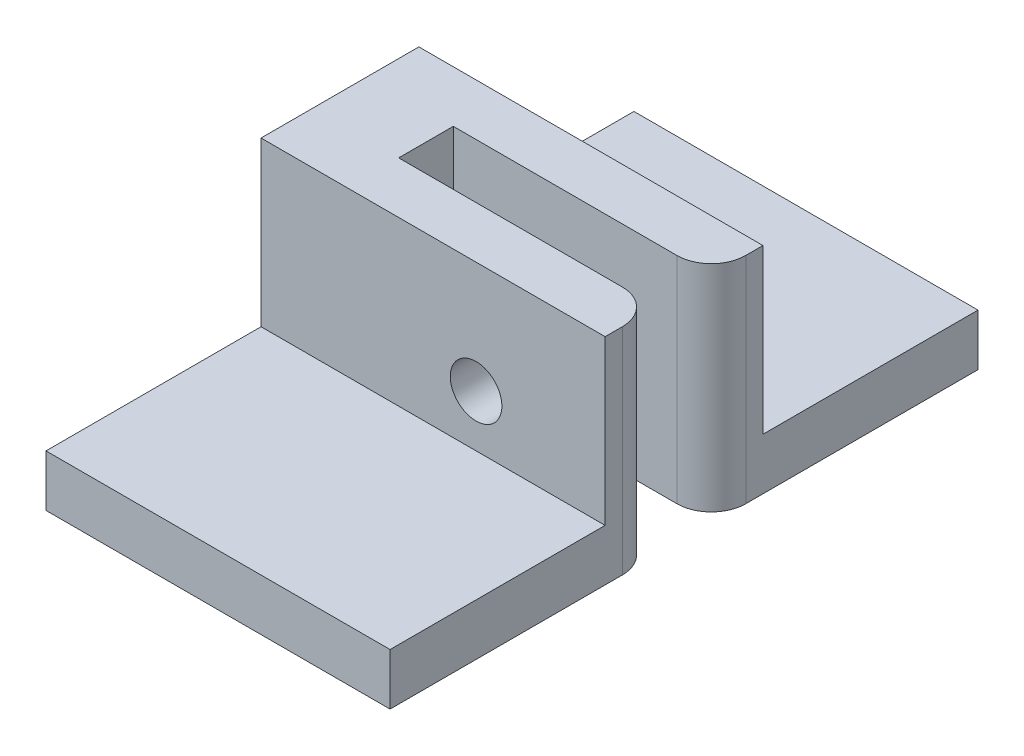
ISO-10303-21;
HEADER;
FILE_DESCRIPTION(('STEP AP214'),'2;1');
FILE_NAME('part.step','',(''),(''),'','','');
FILE_SCHEMA(('AUTOMOTIVE_DESIGN { 1 0 10303 214 1 1 1 1 }'));
ENDSEC;
DATA;
#1=APPLICATION_CONTEXT('core data for automotive mechanical design processes');
#2=APPLICATION_PROTOCOL_DEFINITION('international standard','automotive_design',2000,#1);
#3=PRODUCT_CONTEXT('',#1,'mechanical');
#4=PRODUCT('Part','Part','',(#3));
#5=PRODUCT_RELATED_PRODUCT_CATEGORY('part','',(#4));
#6=PRODUCT_DEFINITION_FORMATION('','',#4);
#7=PRODUCT_DEFINITION_CONTEXT('part definition',#1,'design');
#8=PRODUCT_DEFINITION('design','',#6,#7);
#9=PRODUCT_DEFINITION_SHAPE('','',#8);
#10=(LENGTH_UNIT() NAMED_UNIT(*) SI_UNIT(.MILLI.,.METRE.));
#11=(NAMED_UNIT(*) PLANE_ANGLE_UNIT() SI_UNIT($,.RADIAN.));
#12=(NAMED_UNIT(*) SI_UNIT($,.STERADIAN.) SOLID_ANGLE_UNIT());
#13=UNCERTAINTY_MEASURE_WITH_UNIT(LENGTH_MEASURE(1.E-05),#10,'distance_accuracy_value','');
#14=(GEOMETRIC_REPRESENTATION_CONTEXT(3) GLOBAL_UNCERTAINTY_ASSIGNED_CONTEXT((#13)) GLOBAL_UNIT_ASSIGNED_CONTEXT((#10,
#11,#12)) REPRESENTATION_CONTEXT('',''));
#15=CARTESIAN_POINT('',(0.,0.,0.));
#16=DIRECTION('',(0.,0.,1.));
#17=DIRECTION('',(1.,0.,0.));
#18=AXIS2_PLACEMENT_3D('',#15,#16,#17);
#19=CARTESIAN_POINT('',(20.,0.,0.));
#20=DIRECTION('',(1.,0.,0.));
#21=DIRECTION('',(0.,0.,-1.));
#22=AXIS2_PLACEMENT_3D('',#19,#20,#21);
#23=PLANE('',#22);
#24=DIRECTION('',(0.,0.,1.));
#25=VECTOR('',#24,1.);
#26=CARTESIAN_POINT('',(20.,12.5,0.));
#27=LINE('',#26,#25);
#28=CARTESIAN_POINT('',(20.,12.5,-3.));
#29=VERTEX_POINT('',#28);
#30=CARTESIAN_POINT('',(20.,12.5,-2.));
#31=VERTEX_POINT('',#30);
#32=EDGE_CURVE('E182',#29,#31,#27,.T.);
#33=ORIENTED_EDGE('',*,*,#32,.T.);
#34=DIRECTION('',(0.,1.,0.));
#35=VECTOR('',#34,1.);
#36=CARTESIAN_POINT('',(20.,0.,-2.));
#37=LINE('',#36,#35);
#38=CARTESIAN_POINT('',(20.,0.,-2.));
#39=VERTEX_POINT('',#38);
#40=EDGE_CURVE('E11',#31,#39,#37,.F.);
#41=ORIENTED_EDGE('',*,*,#40,.T.);
#42=DIRECTION('',(0.,0.,-1.));
#43=VECTOR('',#42,1.);
#44=CARTESIAN_POINT('',(20.,0.,-15.5));
#45=LINE('',#44,#43);
#46=CARTESIAN_POINT('',(20.,0.,-15.5));
#47=VERTEX_POINT('',#46);
#48=EDGE_CURVE('E175',#39,#47,#45,.T.);
#49=ORIENTED_EDGE('',*,*,#48,.T.);
#50=DIRECTION('',(0.,1.,0.));
#51=VECTOR('',#50,1.);
#52=CARTESIAN_POINT('',(20.,3.,-15.5));
#53=LINE('',#52,#51);
#54=CARTESIAN_POINT('',(20.,3.,-15.5));
#55=VERTEX_POINT('',#54);
#56=EDGE_CURVE('E174',#47,#55,#53,.T.);
#57=ORIENTED_EDGE('',*,*,#56,.T.);
#58=DIRECTION('',(0.,0.,1.));
#59=VECTOR('',#58,1.);
#60=CARTESIAN_POINT('',(20.,3.,-3.));
#61=LINE('',#60,#59);
#62=CARTESIAN_POINT('',(20.,3.,-3.));
#63=VERTEX_POINT('',#62);
#64=EDGE_CURVE('E177',#55,#63,#61,.T.);
#65=ORIENTED_EDGE('',*,*,#64,.T.);
#66=DIRECTION('',(0.,1.,0.));
#67=VECTOR('',#66,1.);
#68=CARTESIAN_POINT('',(20.,12.5,-3.));
#69=LINE('',#68,#67);
#70=EDGE_CURVE('E179',#63,#29,#69,.T.);
#71=ORIENTED_EDGE('',*,*,#70,.T.);
#72=EDGE_LOOP('',(#33,#41,#49,#57,#65,#71));
#73=FACE_BOUND('',#72,.T.);
#74=ADVANCED_FACE('F36',(#73),#23,.T.);
#75=CARTESIAN_POINT('',(20.,3.,-15.5));
#76=DIRECTION('',(0.,0.,1.));
#77=DIRECTION('',(1.,0.,0.));
#78=AXIS2_PLACEMENT_3D('',#75,#76,#77);
#79=PLANE('',#78);
#80=DIRECTION('',(0.,1.,0.));
#81=VECTOR('',#80,1.);
#82=CARTESIAN_POINT('',(0.,3.,-15.5));
#83=LINE('',#82,#81);
#84=CARTESIAN_POINT('',(0.,0.,-15.5));
#85=VERTEX_POINT('',#84);
#86=CARTESIAN_POINT('',(0.,3.,-15.5));
#87=VERTEX_POINT('',#86);
#88=EDGE_CURVE('E166',#85,#87,#83,.T.);
#89=ORIENTED_EDGE('',*,*,#88,.T.);
#90=DIRECTION('',(-1.,0.,0.));
#91=VECTOR('',#90,1.);
#92=CARTESIAN_POINT('',(20.,3.,-15.5));
#93=LINE('',#92,#91);
#94=EDGE_CURVE('E226',#55,#87,#93,.T.);
#95=ORIENTED_EDGE('',*,*,#94,.F.);
#96=ORIENTED_EDGE('',*,*,#56,.F.);
#97=DIRECTION('',(-1.,0.,0.));
#98=VECTOR('',#97,1.);
#99=CARTESIAN_POINT('',(20.,0.,-15.5));
#100=LINE('',#99,#98);
#101=EDGE_CURVE('E229',#47,#85,#100,.T.);
#102=ORIENTED_EDGE('',*,*,#101,.T.);
#103=EDGE_LOOP('',(#89,#95,#96,#102));
#104=FACE_BOUND('',#103,.T.);
#105=ADVANCED_FACE('F277',(#104),#79,.F.);
#106=CARTESIAN_POINT('',(20.,3.,-3.));
#107=DIRECTION('',(0.,-1.,0.));
#108=DIRECTION('',(0.,0.,-1.));
#109=AXIS2_PLACEMENT_3D('',#106,#107,#108);
#110=PLANE('',#109);
#111=DIRECTION('',(0.,0.,1.));
#112=VECTOR('',#111,1.);
#113=CARTESIAN_POINT('',(0.,3.,-3.));
#114=LINE('',#113,#112);
#115=CARTESIAN_POINT('',(0.,3.,-3.));
#116=VERTEX_POINT('',#115);
#117=EDGE_CURVE('E193',#87,#116,#114,.T.);
#118=ORIENTED_EDGE('',*,*,#117,.T.);
#119=DIRECTION('',(-1.,0.,0.));
#120=VECTOR('',#119,1.);
#121=CARTESIAN_POINT('',(20.,3.,-3.));
#122=LINE('',#121,#120);
#123=EDGE_CURVE('E223',#63,#116,#122,.T.);
#124=ORIENTED_EDGE('',*,*,#123,.F.);
#125=ORIENTED_EDGE('',*,*,#64,.F.);
#126=ORIENTED_EDGE('',*,*,#94,.T.);
#127=EDGE_LOOP('',(#118,#124,#125,#126));
#128=FACE_BOUND('',#127,.T.);
#129=ADVANCED_FACE('F292',(#128),#110,.F.);
#130=CARTESIAN_POINT('',(20.,12.5,-3.));
#131=DIRECTION('',(0.,0.,1.));
#132=DIRECTION('',(0.,-1.,0.));
#133=AXIS2_PLACEMENT_3D('',#130,#131,#132);
#134=PLANE('',#133);
#135=CARTESIAN_POINT('',(12.5,6.,-3.));
#136=DIRECTION('',(0.,0.,1.));
#137=DIRECTION('',(0.,-1.,0.));
#138=AXIS2_PLACEMENT_3D('',#135,#136,#137);
#139=CIRCLE('',#138,1.5);
#140=CARTESIAN_POINT('',(12.5,4.5,-3.));
#141=VERTEX_POINT('',#140);
#142=EDGE_CURVE('E153',#141,#141,#139,.T.);
#143=ORIENTED_EDGE('',*,*,#142,.T.);
#144=EDGE_LOOP('',(#143));
#145=FACE_BOUND('',#144,.T.);
#146=DIRECTION('',(0.,1.,0.));
#147=VECTOR('',#146,1.);
#148=CARTESIAN_POINT('',(0.,12.5,-3.));
#149=LINE('',#148,#147);
#150=CARTESIAN_POINT('',(0.,12.5,-3.));
#151=VERTEX_POINT('',#150);
#152=EDGE_CURVE('E195',#116,#151,#149,.T.);
#153=ORIENTED_EDGE('',*,*,#152,.T.);
#154=DIRECTION('',(-1.,0.,0.));
#155=VECTOR('',#154,1.);
#156=CARTESIAN_POINT('',(20.,12.5,-3.));
#157=LINE('',#156,#155);
#158=EDGE_CURVE('E220',#29,#151,#157,.T.);
#159=ORIENTED_EDGE('',*,*,#158,.F.);
#160=ORIENTED_EDGE('',*,*,#70,.F.);
#161=ORIENTED_EDGE('',*,*,#123,.T.);
#162=EDGE_LOOP('',(#153,#159,#160,#161));
#163=FACE_BOUND('',#162,.T.);
#164=ADVANCED_FACE('F317',(#145,#163),#134,.F.);
#165=CARTESIAN_POINT('',(20.,12.5,3.175));
#166=DIRECTION('',(0.,-1.,0.));
#167=DIRECTION('',(0.,0.,-1.));
#168=AXIS2_PLACEMENT_3D('',#165,#166,#167);
#169=PLANE('',#168);
#170=CARTESIAN_POINT('',(20.,12.5,5.175));
#171=VERTEX_POINT('',#170);
#172=CARTESIAN_POINT('',(20.,12.5,6.175));
#173=VERTEX_POINT('',#172);
#174=EDGE_CURVE('E181',#171,#173,#27,.T.);
#175=ORIENTED_EDGE('',*,*,#174,.F.);
#176=CARTESIAN_POINT('',(18.,12.5,5.175));
#177=DIRECTION('',(0.,-1.,0.));
#178=DIRECTION('',(0.,0.,-1.));
#179=AXIS2_PLACEMENT_3D('',#176,#177,#178);
#180=CIRCLE('',#179,2.);
#181=CARTESIAN_POINT('',(18.,12.5,3.175));
#182=VERTEX_POINT('',#181);
#183=EDGE_CURVE('E247',#171,#182,#180,.F.);
#184=ORIENTED_EDGE('',*,*,#183,.T.);
#185=DIRECTION('',(1.,0.,0.));
#186=VECTOR('',#185,1.);
#187=CARTESIAN_POINT('',(5.,12.5,3.175));
#188=LINE('',#187,#186);
#189=CARTESIAN_POINT('',(5.,12.5,3.175));
#190=VERTEX_POINT('',#189);
#191=EDGE_CURVE('E142',#190,#182,#188,.T.);
#192=ORIENTED_EDGE('',*,*,#191,.F.);
#193=DIRECTION('',(0.,0.,1.));
#194=VECTOR('',#193,1.);
#195=CARTESIAN_POINT('',(5.,12.5,3.175));
#196=LINE('',#195,#194);
#197=CARTESIAN_POINT('',(5.,12.5,0.));
#198=VERTEX_POINT('',#197);
#199=EDGE_CURVE('E149',#198,#190,#196,.T.);
#200=ORIENTED_EDGE('',*,*,#199,.F.);
#201=DIRECTION('',(1.,0.,0.));
#202=VECTOR('',#201,1.);
#203=CARTESIAN_POINT('',(5.,12.5,0.));
#204=LINE('',#203,#202);
#205=CARTESIAN_POINT('',(18.,12.5,0.));
#206=VERTEX_POINT('',#205);
#207=EDGE_CURVE('E135',#198,#206,#204,.T.);
#208=ORIENTED_EDGE('',*,*,#207,.T.);
#209=CARTESIAN_POINT('',(18.,12.5,-2.));
#210=DIRECTION('',(0.,-1.,0.));
#211=DIRECTION('',(0.,0.,-1.));
#212=AXIS2_PLACEMENT_3D('',#209,#210,#211);
#213=CIRCLE('',#212,2.);
#214=EDGE_CURVE('E51',#206,#31,#213,.F.);
#215=ORIENTED_EDGE('',*,*,#214,.T.);
#216=ORIENTED_EDGE('',*,*,#32,.F.);
#217=ORIENTED_EDGE('',*,*,#158,.T.);
#218=DIRECTION('',(0.,0.,1.));
#219=VECTOR('',#218,1.);
#220=CARTESIAN_POINT('',(0.,12.5,3.175));
#221=LINE('',#220,#219);
#222=CARTESIAN_POINT('',(0.,12.5,6.175));
#223=VERTEX_POINT('',#222);
#224=EDGE_CURVE('E198',#151,#223,#221,.T.);
#225=ORIENTED_EDGE('',*,*,#224,.T.);
#226=DIRECTION('',(-1.,0.,0.));
#227=VECTOR('',#226,1.);
#228=CARTESIAN_POINT('',(20.,12.5,6.175));
#229=LINE('',#228,#227);
#230=EDGE_CURVE('E217',#173,#223,#229,.T.);
#231=ORIENTED_EDGE('',*,*,#230,.F.);
#232=EDGE_LOOP('',(#175,#184,#192,#200,#208,#215,#216,#217,#225,#231));
#233=FACE_BOUND('',#232,.T.);
#234=ADVANCED_FACE('F156',(#233),#169,.F.);
#235=CARTESIAN_POINT('',(20.,12.5,6.175));
#236=DIRECTION('',(0.,0.,-1.));
#237=DIRECTION('',(0.,1.,0.));
#238=AXIS2_PLACEMENT_3D('',#235,#236,#237);
#239=PLANE('',#238);
#240=CARTESIAN_POINT('',(12.5,6.,6.175));
#241=DIRECTION('',(0.,0.,1.));
#242=DIRECTION('',(1.,0.,0.));
#243=AXIS2_PLACEMENT_3D('',#240,#241,#242);
#244=CIRCLE('',#243,1.5);
#245=CARTESIAN_POINT('',(14.,6.,6.175));
#246=VERTEX_POINT('',#245);
#247=EDGE_CURVE('E237',#246,#246,#244,.T.);
#248=ORIENTED_EDGE('',*,*,#247,.F.);
#249=EDGE_LOOP('',(#248));
#250=FACE_BOUND('',#249,.T.);
#251=DIRECTION('',(0.,-1.,0.));
#252=VECTOR('',#251,1.);
#253=CARTESIAN_POINT('',(0.,12.5,6.175));
#254=LINE('',#253,#252);
#255=CARTESIAN_POINT('',(0.,3.,6.175));
#256=VERTEX_POINT('',#255);
#257=EDGE_CURVE('E200',#223,#256,#254,.T.);
#258=ORIENTED_EDGE('',*,*,#257,.T.);
#259=DIRECTION('',(-1.,0.,0.));
#260=VECTOR('',#259,1.);
#261=CARTESIAN_POINT('',(20.,3.,6.175));
#262=LINE('',#261,#260);
#263=CARTESIAN_POINT('',(20.,3.,6.175));
#264=VERTEX_POINT('',#263);
#265=EDGE_CURVE('E214',#264,#256,#262,.T.);
#266=ORIENTED_EDGE('',*,*,#265,.F.);
#267=DIRECTION('',(0.,-1.,0.));
#268=VECTOR('',#267,1.);
#269=CARTESIAN_POINT('',(20.,12.5,6.175));
#270=LINE('',#269,#268);
#271=EDGE_CURVE('E184',#173,#264,#270,.T.);
#272=ORIENTED_EDGE('',*,*,#271,.F.);
#273=ORIENTED_EDGE('',*,*,#230,.T.);
#274=EDGE_LOOP('',(#258,#266,#272,#273));
#275=FACE_BOUND('',#274,.T.);
#276=ADVANCED_FACE('F310',(#250,#275),#239,.F.);
#277=CARTESIAN_POINT('',(20.,3.,6.175));
#278=DIRECTION('',(0.,-1.,0.));
#279=DIRECTION('',(0.,0.,-1.));
#280=AXIS2_PLACEMENT_3D('',#277,#278,#279);
#281=PLANE('',#280);
#282=DIRECTION('',(0.,0.,1.));
#283=VECTOR('',#282,1.);
#284=CARTESIAN_POINT('',(0.,3.,6.175));
#285=LINE('',#284,#283);
#286=CARTESIAN_POINT('',(0.,3.,18.675));
#287=VERTEX_POINT('',#286);
#288=EDGE_CURVE('E202',#256,#287,#285,.T.);
#289=ORIENTED_EDGE('',*,*,#288,.T.);
#290=DIRECTION('',(-1.,0.,0.));
#291=VECTOR('',#290,1.);
#292=CARTESIAN_POINT('',(20.,3.,18.675));
#293=LINE('',#292,#291);
#294=CARTESIAN_POINT('',(20.,3.,18.675));
#295=VERTEX_POINT('',#294);
#296=EDGE_CURVE('E211',#295,#287,#293,.T.);
#297=ORIENTED_EDGE('',*,*,#296,.F.);
#298=DIRECTION('',(0.,0.,1.));
#299=VECTOR('',#298,1.);
#300=CARTESIAN_POINT('',(20.,3.,6.175));
#301=LINE('',#300,#299);
#302=EDGE_CURVE('E186',#264,#295,#301,.T.);
#303=ORIENTED_EDGE('',*,*,#302,.F.);
#304=ORIENTED_EDGE('',*,*,#265,.T.);
#305=EDGE_LOOP('',(#289,#297,#303,#304));
#306=FACE_BOUND('',#305,.T.);
#307=ADVANCED_FACE('F305',(#306),#281,.F.);
#308=CARTESIAN_POINT('',(20.,3.,18.675));
#309=DIRECTION('',(0.,0.,-1.));
#310=DIRECTION('',(-1.,0.,0.));
#311=AXIS2_PLACEMENT_3D('',#308,#309,#310);
#312=PLANE('',#311);
#313=DIRECTION('',(0.,-1.,0.));
#314=VECTOR('',#313,1.);
#315=CARTESIAN_POINT('',(0.,3.,18.675));
#316=LINE('',#315,#314);
#317=CARTESIAN_POINT('',(0.,0.,18.675));
#318=VERTEX_POINT('',#317);
#319=EDGE_CURVE('E204',#287,#318,#316,.T.);
#320=ORIENTED_EDGE('',*,*,#319,.T.);
#321=DIRECTION('',(-1.,0.,0.));
#322=VECTOR('',#321,1.);
#323=CARTESIAN_POINT('',(20.,0.,18.675));
#324=LINE('',#323,#322);
#325=CARTESIAN_POINT('',(20.,0.,18.675));
#326=VERTEX_POINT('',#325);
#327=EDGE_CURVE('E191',#326,#318,#324,.T.);
#328=ORIENTED_EDGE('',*,*,#327,.F.);
#329=DIRECTION('',(0.,-1.,0.));
#330=VECTOR('',#329,1.);
#331=CARTESIAN_POINT('',(20.,3.,18.675));
#332=LINE('',#331,#330);
#333=EDGE_CURVE('E188',#295,#326,#332,.T.);
#334=ORIENTED_EDGE('',*,*,#333,.F.);
#335=ORIENTED_EDGE('',*,*,#296,.T.);
#336=EDGE_LOOP('',(#320,#328,#334,#335));
#337=FACE_BOUND('',#336,.T.);
#338=ADVANCED_FACE('F265',(#337),#312,.F.);
#339=CARTESIAN_POINT('',(20.,0.,0.));
#340=DIRECTION('',(0.,1.,0.));
#341=DIRECTION('',(0.,0.,1.));
#342=AXIS2_PLACEMENT_3D('',#339,#340,#341);
#343=PLANE('',#342);
#344=DIRECTION('',(1.,0.,0.));
#345=VECTOR('',#344,1.);
#346=CARTESIAN_POINT('',(5.,0.,3.175));
#347=LINE('',#346,#345);
#348=CARTESIAN_POINT('',(5.,0.,3.175));
#349=VERTEX_POINT('',#348);
#350=CARTESIAN_POINT('',(18.,0.,3.175));
#351=VERTEX_POINT('',#350);
#352=EDGE_CURVE('E167',#349,#351,#347,.T.);
#353=ORIENTED_EDGE('',*,*,#352,.T.);
#354=CARTESIAN_POINT('',(18.,0.,5.175));
#355=DIRECTION('',(0.,1.,0.));
#356=DIRECTION('',(0.,0.,1.));
#357=AXIS2_PLACEMENT_3D('',#354,#355,#356);
#358=CIRCLE('',#357,2.);
#359=CARTESIAN_POINT('',(20.,0.,5.175));
#360=VERTEX_POINT('',#359);
#361=EDGE_CURVE('E242',#351,#360,#358,.F.);
#362=ORIENTED_EDGE('',*,*,#361,.T.);
#363=EDGE_CURVE('E171',#326,#360,#45,.T.);
#364=ORIENTED_EDGE('',*,*,#363,.F.);
#365=ORIENTED_EDGE('',*,*,#327,.T.);
#366=DIRECTION('',(0.,0.,-1.));
#367=VECTOR('',#366,1.);
#368=CARTESIAN_POINT('',(0.,0.,0.));
#369=LINE('',#368,#367);
#370=EDGE_CURVE('E207',#318,#85,#369,.T.);
#371=ORIENTED_EDGE('',*,*,#370,.T.);
#372=ORIENTED_EDGE('',*,*,#101,.F.);
#373=ORIENTED_EDGE('',*,*,#48,.F.);
#374=CARTESIAN_POINT('',(18.,0.,-2.));
#375=DIRECTION('',(0.,1.,0.));
#376=DIRECTION('',(0.,0.,1.));
#377=AXIS2_PLACEMENT_3D('',#374,#375,#376);
#378=CIRCLE('',#377,2.);
#379=CARTESIAN_POINT('',(18.,0.,0.));
#380=VERTEX_POINT('',#379);
#381=EDGE_CURVE('E240',#39,#380,#378,.F.);
#382=ORIENTED_EDGE('',*,*,#381,.T.);
#383=DIRECTION('',(1.,0.,0.));
#384=VECTOR('',#383,1.);
#385=CARTESIAN_POINT('',(5.,0.,0.));
#386=LINE('',#385,#384);
#387=CARTESIAN_POINT('',(5.,0.,0.));
#388=VERTEX_POINT('',#387);
#389=EDGE_CURVE('E164',#388,#380,#386,.T.);
#390=ORIENTED_EDGE('',*,*,#389,.F.);
#391=DIRECTION('',(0.,0.,-1.));
#392=VECTOR('',#391,1.);
#393=CARTESIAN_POINT('',(5.,0.,3.175));
#394=LINE('',#393,#392);
#395=EDGE_CURVE('E143',#349,#388,#394,.T.);
#396=ORIENTED_EDGE('',*,*,#395,.F.);
#397=EDGE_LOOP('',(#353,#362,#364,#365,#371,#372,#373,#382,#390,#396));
#398=FACE_BOUND('',#397,.T.);
#399=ADVANCED_FACE('F257',(#398),#343,.F.);
#400=ORIENTED_EDGE('',*,*,#363,.T.);
#401=DIRECTION('',(0.,-1.,0.));
#402=VECTOR('',#401,1.);
#403=CARTESIAN_POINT('',(20.,12.5,5.175));
#404=LINE('',#403,#402);
#405=EDGE_CURVE('E244',#360,#171,#404,.F.);
#406=ORIENTED_EDGE('',*,*,#405,.T.);
#407=ORIENTED_EDGE('',*,*,#174,.T.);
#408=ORIENTED_EDGE('',*,*,#271,.T.);
#409=ORIENTED_EDGE('',*,*,#302,.T.);
#410=ORIENTED_EDGE('',*,*,#333,.T.);
#411=EDGE_LOOP('',(#400,#406,#407,#408,#409,#410));
#412=FACE_BOUND('',#411,.T.);
#413=ADVANCED_FACE('F259',(#412),#23,.T.);
#414=CARTESIAN_POINT('',(0.,0.,0.));
#415=DIRECTION('',(1.,0.,0.));
#416=DIRECTION('',(0.,0.,-1.));
#417=AXIS2_PLACEMENT_3D('',#414,#415,#416);
#418=PLANE('',#417);
#419=ORIENTED_EDGE('',*,*,#88,.F.);
#420=ORIENTED_EDGE('',*,*,#370,.F.);
#421=ORIENTED_EDGE('',*,*,#319,.F.);
#422=ORIENTED_EDGE('',*,*,#288,.F.);
#423=ORIENTED_EDGE('',*,*,#257,.F.);
#424=ORIENTED_EDGE('',*,*,#224,.F.);
#425=ORIENTED_EDGE('',*,*,#152,.F.);
#426=ORIENTED_EDGE('',*,*,#117,.F.);
#427=EDGE_LOOP('',(#419,#420,#421,#422,#423,#424,#425,#426));
#428=FACE_BOUND('',#427,.T.);
#429=ADVANCED_FACE('F272',(#428),#418,.F.);
#430=CARTESIAN_POINT('',(5.,12.5,0.));
#431=DIRECTION('',(0.,0.,-1.));
#432=DIRECTION('',(-1.,0.,0.));
#433=AXIS2_PLACEMENT_3D('',#430,#431,#432);
#434=PLANE('',#433);
#435=CARTESIAN_POINT('',(12.5,6.,0.));
#436=DIRECTION('',(0.,0.,-1.));
#437=DIRECTION('',(-1.,0.,0.));
#438=AXIS2_PLACEMENT_3D('',#435,#436,#437);
#439=CIRCLE('',#438,1.5);
#440=CARTESIAN_POINT('',(11.,6.,0.));
#441=VERTEX_POINT('',#440);
#442=EDGE_CURVE('E236',#441,#441,#439,.T.);
#443=ORIENTED_EDGE('',*,*,#442,.T.);
#444=EDGE_LOOP('',(#443));
#445=FACE_BOUND('',#444,.T.);
#446=ORIENTED_EDGE('',*,*,#389,.T.);
#447=DIRECTION('',(0.,1.,0.));
#448=VECTOR('',#447,1.);
#449=CARTESIAN_POINT('',(18.,12.5,0.));
#450=LINE('',#449,#448);
#451=EDGE_CURVE('E44',#380,#206,#450,.T.);
#452=ORIENTED_EDGE('',*,*,#451,.T.);
#453=ORIENTED_EDGE('',*,*,#207,.F.);
#454=DIRECTION('',(0.,1.,0.));
#455=VECTOR('',#454,1.);
#456=CARTESIAN_POINT('',(5.,12.5,0.));
#457=LINE('',#456,#455);
#458=EDGE_CURVE('E139',#388,#198,#457,.T.);
#459=ORIENTED_EDGE('',*,*,#458,.F.);
#460=EDGE_LOOP('',(#446,#452,#453,#459));
#461=FACE_BOUND('',#460,.T.);
#462=ADVANCED_FACE('F138',(#445,#461),#434,.F.);
#463=CARTESIAN_POINT('',(5.,12.5,3.175));
#464=DIRECTION('',(0.,0.,1.));
#465=DIRECTION('',(1.,0.,0.));
#466=AXIS2_PLACEMENT_3D('',#463,#464,#465);
#467=PLANE('',#466);
#468=CARTESIAN_POINT('',(12.5,6.,3.175));
#469=DIRECTION('',(0.,0.,1.));
#470=DIRECTION('',(1.,0.,0.));
#471=AXIS2_PLACEMENT_3D('',#468,#469,#470);
#472=CIRCLE('',#471,1.5);
#473=CARTESIAN_POINT('',(14.,6.,3.175));
#474=VERTEX_POINT('',#473);
#475=EDGE_CURVE('E233',#474,#474,#472,.T.);
#476=ORIENTED_EDGE('',*,*,#475,.T.);
#477=EDGE_LOOP('',(#476));
#478=FACE_BOUND('',#477,.T.);
#479=ORIENTED_EDGE('',*,*,#191,.T.);
#480=DIRECTION('',(0.,-1.,0.));
#481=VECTOR('',#480,1.);
#482=CARTESIAN_POINT('',(18.,0.,3.175));
#483=LINE('',#482,#481);
#484=EDGE_CURVE('E232',#182,#351,#483,.T.);
#485=ORIENTED_EDGE('',*,*,#484,.T.);
#486=ORIENTED_EDGE('',*,*,#352,.F.);
#487=DIRECTION('',(0.,-1.,0.));
#488=VECTOR('',#487,1.);
#489=CARTESIAN_POINT('',(5.,12.5,3.175));
#490=LINE('',#489,#488);
#491=EDGE_CURVE('E158',#190,#349,#490,.T.);
#492=ORIENTED_EDGE('',*,*,#491,.F.);
#493=EDGE_LOOP('',(#479,#485,#486,#492));
#494=FACE_BOUND('',#493,.T.);
#495=ADVANCED_FACE('F254',(#478,#494),#467,.F.);
#496=CARTESIAN_POINT('',(5.,0.,0.));
#497=DIRECTION('',(1.,0.,0.));
#498=DIRECTION('',(0.,0.,-1.));
#499=AXIS2_PLACEMENT_3D('',#496,#497,#498);
#500=PLANE('',#499);
#501=ORIENTED_EDGE('',*,*,#458,.T.);
#502=ORIENTED_EDGE('',*,*,#199,.T.);
#503=ORIENTED_EDGE('',*,*,#491,.T.);
#504=ORIENTED_EDGE('',*,*,#395,.T.);
#505=EDGE_LOOP('',(#501,#502,#503,#504));
#506=FACE_BOUND('',#505,.T.);
#507=ADVANCED_FACE('F147',(#506),#500,.T.);
#508=CARTESIAN_POINT('',(12.5,6.,-15.5));
#509=DIRECTION('',(0.,0.,1.));
#510=DIRECTION('',(1.,0.,0.));
#511=AXIS2_PLACEMENT_3D('',#508,#509,#510);
#512=CYLINDRICAL_SURFACE('',#511,1.5);
#513=ORIENTED_EDGE('',*,*,#247,.T.);
#514=EDGE_LOOP('',(#513));
#515=FACE_BOUND('',#514,.T.);
#516=ORIENTED_EDGE('',*,*,#475,.F.);
#517=EDGE_LOOP('',(#516));
#518=FACE_BOUND('',#517,.T.);
#519=ADVANCED_FACE('F374',(#515,#518),#512,.F.);
#520=ORIENTED_EDGE('',*,*,#442,.F.);
#521=EDGE_LOOP('',(#520));
#522=FACE_BOUND('',#521,.T.);
#523=ORIENTED_EDGE('',*,*,#142,.F.);
#524=EDGE_LOOP('',(#523));
#525=FACE_BOUND('',#524,.T.);
#526=ADVANCED_FACE('F286',(#522,#525),#512,.F.);
#527=CARTESIAN_POINT('',(18.,12.5,5.175));
#528=DIRECTION('',(0.,1.,0.));
#529=DIRECTION('',(0.,0.,1.));
#530=AXIS2_PLACEMENT_3D('',#527,#528,#529);
#531=CYLINDRICAL_SURFACE('',#530,2.);
#532=ORIENTED_EDGE('',*,*,#183,.F.);
#533=ORIENTED_EDGE('',*,*,#405,.F.);
#534=ORIENTED_EDGE('',*,*,#361,.F.);
#535=ORIENTED_EDGE('',*,*,#484,.F.);
#536=EDGE_LOOP('',(#532,#533,#534,#535));
#537=FACE_BOUND('',#536,.T.);
#538=ADVANCED_FACE('F255',(#537),#531,.T.);
#539=CARTESIAN_POINT('',(18.,12.5,-2.));
#540=DIRECTION('',(0.,-1.,0.));
#541=DIRECTION('',(0.,0.,-1.));
#542=AXIS2_PLACEMENT_3D('',#539,#540,#541);
#543=CYLINDRICAL_SURFACE('',#542,2.);
#544=ORIENTED_EDGE('',*,*,#381,.F.);
#545=ORIENTED_EDGE('',*,*,#40,.F.);
#546=ORIENTED_EDGE('',*,*,#214,.F.);
#547=ORIENTED_EDGE('',*,*,#451,.F.);
#548=EDGE_LOOP('',(#544,#545,#546,#547));
#549=FACE_BOUND('',#548,.T.);
#550=ADVANCED_FACE('F38',(#549),#543,.T.);
#551=CLOSED_SHELL('',(#74,#105,#129,#164,#234,#276,#307,#338,#399,#413,#429,#462,#495,#507,#519,
#526,#538,#550));
#552=MANIFOLD_SOLID_BREP('B2',#551);
#553=ADVANCED_BREP_SHAPE_REPRESENTATION('',(#18,#552),#14);
#554=SHAPE_DEFINITION_REPRESENTATION(#9,#553);
ENDSEC;
END-ISO-10303-21;
